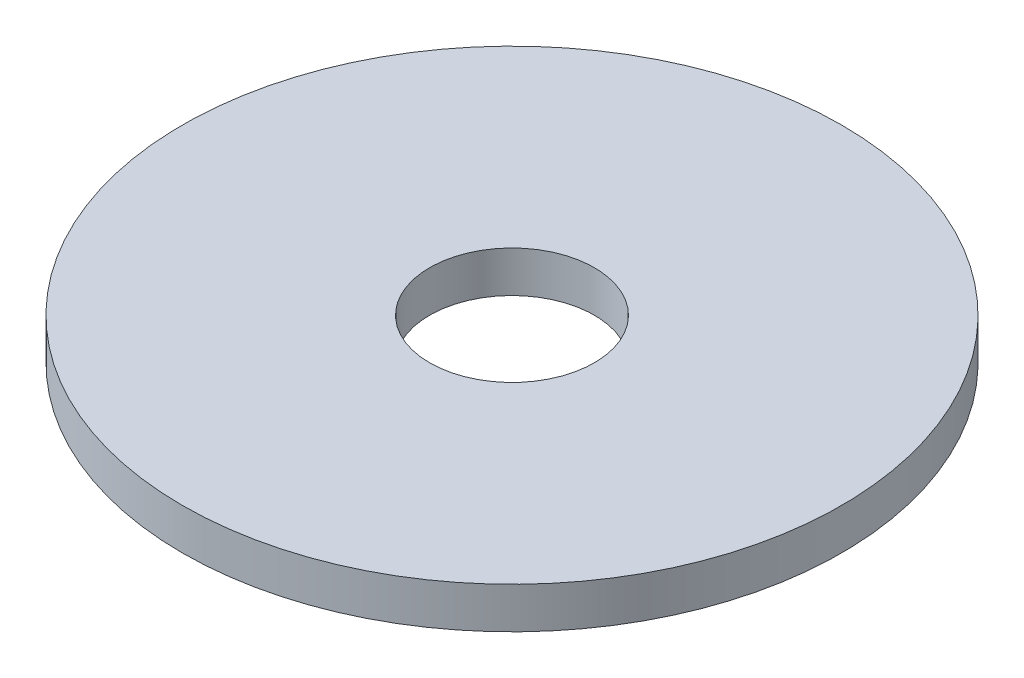
ISO-10303-21;
HEADER;
FILE_DESCRIPTION(('STEP AP214'),'2;1');
FILE_NAME('part.step','',(''),(''),'','','');
FILE_SCHEMA(('AUTOMOTIVE_DESIGN { 1 0 10303 214 1 1 1 1 }'));
ENDSEC;
DATA;
#1=APPLICATION_CONTEXT('core data for automotive mechanical design processes');
#2=APPLICATION_PROTOCOL_DEFINITION('international standard','automotive_design',2000,#1);
#3=PRODUCT_CONTEXT('',#1,'mechanical');
#4=PRODUCT('Part','Part','',(#3));
#5=PRODUCT_RELATED_PRODUCT_CATEGORY('part','',(#4));
#6=PRODUCT_DEFINITION_FORMATION('','',#4);
#7=PRODUCT_DEFINITION_CONTEXT('part definition',#1,'design');
#8=PRODUCT_DEFINITION('design','',#6,#7);
#9=PRODUCT_DEFINITION_SHAPE('','',#8);
#10=(LENGTH_UNIT() NAMED_UNIT(*) SI_UNIT(.MILLI.,.METRE.));
#11=(NAMED_UNIT(*) PLANE_ANGLE_UNIT() SI_UNIT($,.RADIAN.));
#12=(NAMED_UNIT(*) SI_UNIT($,.STERADIAN.) SOLID_ANGLE_UNIT());
#13=UNCERTAINTY_MEASURE_WITH_UNIT(LENGTH_MEASURE(1.E-05),#10,'distance_accuracy_value','');
#14=(GEOMETRIC_REPRESENTATION_CONTEXT(3) GLOBAL_UNCERTAINTY_ASSIGNED_CONTEXT((#13)) GLOBAL_UNIT_ASSIGNED_CONTEXT((#10,
#11,#12)) REPRESENTATION_CONTEXT('',''));
#15=CARTESIAN_POINT('',(0.,0.,0.));
#16=DIRECTION('',(0.,0.,1.));
#17=DIRECTION('',(1.,0.,0.));
#18=AXIS2_PLACEMENT_3D('',#15,#16,#17);
#19=CARTESIAN_POINT('',(0.,5.,0.));
#20=DIRECTION('',(0.,1.,0.));
#21=DIRECTION('',(0.,0.,1.));
#22=AXIS2_PLACEMENT_3D('',#19,#20,#21);
#23=PLANE('',#22);
#24=CARTESIAN_POINT('',(0.,5.,0.));
#25=DIRECTION('',(0.,1.,0.));
#26=DIRECTION('',(0.,0.,1.));
#27=AXIS2_PLACEMENT_3D('',#24,#25,#26);
#28=CIRCLE('',#27,40.);
#29=CARTESIAN_POINT('',(0.,5.,40.));
#30=VERTEX_POINT('',#29);
#31=EDGE_CURVE('E10',#30,#30,#28,.T.);
#32=ORIENTED_EDGE('',*,*,#31,.T.);
#33=EDGE_LOOP('',(#32));
#34=FACE_BOUND('',#33,.T.);
#35=CARTESIAN_POINT('',(0.,5.,0.));
#36=DIRECTION('',(0.,1.,0.));
#37=DIRECTION('',(0.,0.,1.));
#38=AXIS2_PLACEMENT_3D('',#35,#36,#37);
#39=CIRCLE('',#38,10.);
#40=CARTESIAN_POINT('',(0.,5.,10.));
#41=VERTEX_POINT('',#40);
#42=EDGE_CURVE('E56',#41,#41,#39,.T.);
#43=ORIENTED_EDGE('',*,*,#42,.F.);
#44=EDGE_LOOP('',(#43));
#45=FACE_BOUND('',#44,.T.);
#46=ADVANCED_FACE('F43',(#34,#45),#23,.T.);
#47=CARTESIAN_POINT('',(0.,0.,0.));
#48=DIRECTION('',(0.,1.,0.));
#49=DIRECTION('',(0.,0.,1.));
#50=AXIS2_PLACEMENT_3D('',#47,#48,#49);
#51=PLANE('',#50);
#52=CARTESIAN_POINT('',(0.,0.,0.));
#53=DIRECTION('',(0.,1.,0.));
#54=DIRECTION('',(0.,0.,1.));
#55=AXIS2_PLACEMENT_3D('',#52,#53,#54);
#56=CIRCLE('',#55,40.);
#57=CARTESIAN_POINT('',(0.,0.,40.));
#58=VERTEX_POINT('',#57);
#59=EDGE_CURVE('E47',#58,#58,#56,.T.);
#60=ORIENTED_EDGE('',*,*,#59,.F.);
#61=EDGE_LOOP('',(#60));
#62=FACE_BOUND('',#61,.T.);
#63=CARTESIAN_POINT('',(0.,0.,0.));
#64=DIRECTION('',(0.,1.,0.));
#65=DIRECTION('',(0.,0.,1.));
#66=AXIS2_PLACEMENT_3D('',#63,#64,#65);
#67=CIRCLE('',#66,10.);
#68=CARTESIAN_POINT('',(0.,0.,10.));
#69=VERTEX_POINT('',#68);
#70=EDGE_CURVE('E58',#69,#69,#67,.T.);
#71=ORIENTED_EDGE('',*,*,#70,.T.);
#72=EDGE_LOOP('',(#71));
#73=FACE_BOUND('',#72,.T.);
#74=ADVANCED_FACE('F70',(#62,#73),#51,.F.);
#75=CARTESIAN_POINT('',(0.,5.,0.));
#76=DIRECTION('',(0.,-1.,0.));
#77=DIRECTION('',(0.,0.,-1.));
#78=AXIS2_PLACEMENT_3D('',#75,#76,#77);
#79=CYLINDRICAL_SURFACE('',#78,40.);
#80=ORIENTED_EDGE('',*,*,#31,.F.);
#81=EDGE_LOOP('',(#80));
#82=FACE_BOUND('',#81,.T.);
#83=ORIENTED_EDGE('',*,*,#59,.T.);
#84=EDGE_LOOP('',(#83));
#85=FACE_BOUND('',#84,.T.);
#86=ADVANCED_FACE('F45',(#82,#85),#79,.T.);
#87=CARTESIAN_POINT('',(0.,5.,0.));
#88=DIRECTION('',(0.,-1.,0.));
#89=DIRECTION('',(0.,0.,-1.));
#90=AXIS2_PLACEMENT_3D('',#87,#88,#89);
#91=CYLINDRICAL_SURFACE('',#90,10.);
#92=ORIENTED_EDGE('',*,*,#42,.T.);
#93=EDGE_LOOP('',(#92));
#94=FACE_BOUND('',#93,.T.);
#95=ORIENTED_EDGE('',*,*,#70,.F.);
#96=EDGE_LOOP('',(#95));
#97=FACE_BOUND('',#96,.T.);
#98=ADVANCED_FACE('F66',(#94,#97),#91,.F.);
#99=CLOSED_SHELL('',(#46,#74,#86,#98));
#100=MANIFOLD_SOLID_BREP('B2',#99);
#101=ADVANCED_BREP_SHAPE_REPRESENTATION('',(#18,#100),#14);
#102=SHAPE_DEFINITION_REPRESENTATION(#9,#101);
ENDSEC;
END-ISO-10303-21;
